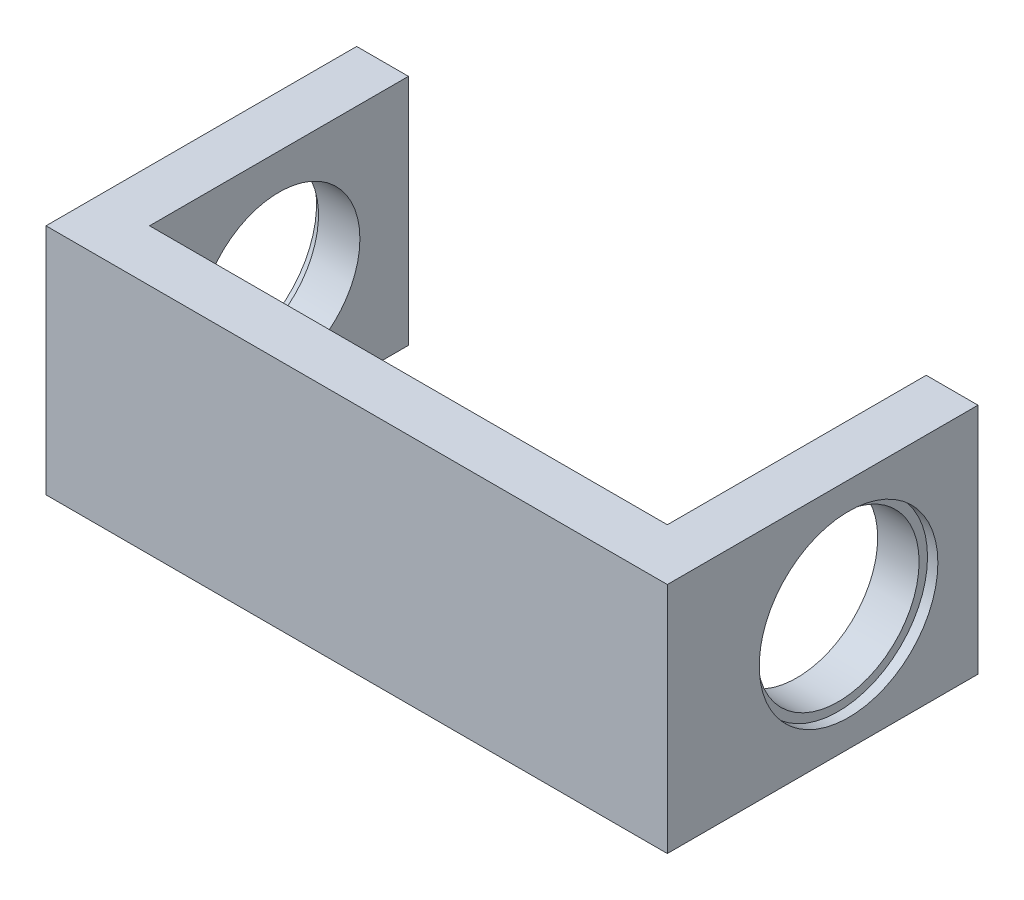
ISO-10303-21;
HEADER;
FILE_DESCRIPTION(('STEP AP214'),'2;1');
FILE_NAME('part.step','',(''),(''),'','','');
FILE_SCHEMA(('AUTOMOTIVE_DESIGN { 1 0 10303 214 1 1 1 1 }'));
ENDSEC;
DATA;
#1=APPLICATION_CONTEXT('core data for automotive mechanical design processes');
#2=APPLICATION_PROTOCOL_DEFINITION('international standard','automotive_design',2000,#1);
#3=PRODUCT_CONTEXT('',#1,'mechanical');
#4=PRODUCT('Part','Part','',(#3));
#5=PRODUCT_RELATED_PRODUCT_CATEGORY('part','',(#4));
#6=PRODUCT_DEFINITION_FORMATION('','',#4);
#7=PRODUCT_DEFINITION_CONTEXT('part definition',#1,'design');
#8=PRODUCT_DEFINITION('design','',#6,#7);
#9=PRODUCT_DEFINITION_SHAPE('','',#8);
#10=(LENGTH_UNIT() NAMED_UNIT(*) SI_UNIT(.MILLI.,.METRE.));
#11=(NAMED_UNIT(*) PLANE_ANGLE_UNIT() SI_UNIT($,.RADIAN.));
#12=(NAMED_UNIT(*) SI_UNIT($,.STERADIAN.) SOLID_ANGLE_UNIT());
#13=UNCERTAINTY_MEASURE_WITH_UNIT(LENGTH_MEASURE(1.E-05),#10,'distance_accuracy_value','');
#14=(GEOMETRIC_REPRESENTATION_CONTEXT(3) GLOBAL_UNCERTAINTY_ASSIGNED_CONTEXT((#13)) GLOBAL_UNIT_ASSIGNED_CONTEXT((#10,
#11,#12)) REPRESENTATION_CONTEXT('',''));
#15=CARTESIAN_POINT('',(0.,0.,0.));
#16=DIRECTION('',(0.,0.,1.));
#17=DIRECTION('',(1.,0.,0.));
#18=AXIS2_PLACEMENT_3D('',#15,#16,#17);
#19=CARTESIAN_POINT('',(55.88,22.86,0.));
#20=DIRECTION('',(-1.,0.,0.));
#21=DIRECTION('',(0.,0.,1.));
#22=AXIS2_PLACEMENT_3D('',#19,#20,#21);
#23=PLANE('',#22);
#24=CARTESIAN_POINT('',(55.88,11.43,-12.7));
#25=DIRECTION('',(1.,0.,0.));
#26=DIRECTION('',(0.,0.,-1.));
#27=AXIS2_PLACEMENT_3D('',#24,#25,#26);
#28=CIRCLE('',#27,8.763);
#29=CARTESIAN_POINT('',(55.88,11.43,-21.463));
#30=VERTEX_POINT('',#29);
#31=EDGE_CURVE('E190',#30,#30,#28,.T.);
#32=ORIENTED_EDGE('',*,*,#31,.F.);
#33=EDGE_LOOP('',(#32));
#34=FACE_BOUND('',#33,.T.);
#35=DIRECTION('',(0.,0.,-1.));
#36=VECTOR('',#35,1.);
#37=CARTESIAN_POINT('',(55.88,0.,0.));
#38=LINE('',#37,#36);
#39=CARTESIAN_POINT('',(55.88,0.,5.08));
#40=VERTEX_POINT('',#39);
#41=CARTESIAN_POINT('',(55.88,0.,-25.4));
#42=VERTEX_POINT('',#41);
#43=EDGE_CURVE('E134',#40,#42,#38,.T.);
#44=ORIENTED_EDGE('',*,*,#43,.T.);
#45=DIRECTION('',(0.,-1.,0.));
#46=VECTOR('',#45,1.);
#47=CARTESIAN_POINT('',(55.88,22.86,-25.4));
#48=LINE('',#47,#46);
#49=CARTESIAN_POINT('',(55.88,22.86,-25.4));
#50=VERTEX_POINT('',#49);
#51=EDGE_CURVE('E11',#50,#42,#48,.T.);
#52=ORIENTED_EDGE('',*,*,#51,.F.);
#53=DIRECTION('',(0.,0.,-1.));
#54=VECTOR('',#53,1.);
#55=CARTESIAN_POINT('',(55.88,22.86,0.));
#56=LINE('',#55,#54);
#57=CARTESIAN_POINT('',(55.88,22.86,5.08));
#58=VERTEX_POINT('',#57);
#59=EDGE_CURVE('E92',#58,#50,#56,.T.);
#60=ORIENTED_EDGE('',*,*,#59,.F.);
#61=DIRECTION('',(0.,-1.,0.));
#62=VECTOR('',#61,1.);
#63=CARTESIAN_POINT('',(55.88,22.86,5.08));
#64=LINE('',#63,#62);
#65=EDGE_CURVE('E133',#58,#40,#64,.T.);
#66=ORIENTED_EDGE('',*,*,#65,.T.);
#67=EDGE_LOOP('',(#44,#52,#60,#66));
#68=FACE_BOUND('',#67,.T.);
#69=ADVANCED_FACE('F37',(#34,#68),#23,.F.);
#70=CARTESIAN_POINT('',(50.8,22.86,-25.4));
#71=DIRECTION('',(0.,0.,-1.));
#72=DIRECTION('',(-1.,0.,0.));
#73=AXIS2_PLACEMENT_3D('',#70,#71,#72);
#74=PLANE('',#73);
#75=DIRECTION('',(1.,0.,0.));
#76=VECTOR('',#75,1.);
#77=CARTESIAN_POINT('',(50.8,0.,-25.4));
#78=LINE('',#77,#76);
#79=CARTESIAN_POINT('',(50.8,0.,-25.4));
#80=VERTEX_POINT('',#79);
#81=EDGE_CURVE('E137',#80,#42,#78,.T.);
#82=ORIENTED_EDGE('',*,*,#81,.F.);
#83=DIRECTION('',(0.,-1.,0.));
#84=VECTOR('',#83,1.);
#85=CARTESIAN_POINT('',(50.8,22.86,-25.4));
#86=LINE('',#85,#84);
#87=CARTESIAN_POINT('',(50.8,22.86,-25.4));
#88=VERTEX_POINT('',#87);
#89=EDGE_CURVE('E45',#88,#80,#86,.T.);
#90=ORIENTED_EDGE('',*,*,#89,.F.);
#91=DIRECTION('',(1.,0.,0.));
#92=VECTOR('',#91,1.);
#93=CARTESIAN_POINT('',(50.8,22.86,-25.4));
#94=LINE('',#93,#92);
#95=EDGE_CURVE('E177',#88,#50,#94,.T.);
#96=ORIENTED_EDGE('',*,*,#95,.T.);
#97=ORIENTED_EDGE('',*,*,#51,.T.);
#98=EDGE_LOOP('',(#82,#90,#96,#97));
#99=FACE_BOUND('',#98,.T.);
#100=ADVANCED_FACE('F168',(#99),#74,.T.);
#101=CARTESIAN_POINT('',(50.8,22.86,0.));
#102=DIRECTION('',(-1.,0.,0.));
#103=DIRECTION('',(0.,0.,1.));
#104=AXIS2_PLACEMENT_3D('',#101,#102,#103);
#105=PLANE('',#104);
#106=CARTESIAN_POINT('',(50.8,11.43,-12.7));
#107=DIRECTION('',(-1.,0.,0.));
#108=DIRECTION('',(0.,0.,1.));
#109=AXIS2_PLACEMENT_3D('',#106,#107,#108);
#110=CIRCLE('',#109,7.9375);
#111=CARTESIAN_POINT('',(50.8,11.43,-4.7625));
#112=VERTEX_POINT('',#111);
#113=EDGE_CURVE('E138',#112,#112,#110,.T.);
#114=ORIENTED_EDGE('',*,*,#113,.F.);
#115=EDGE_LOOP('',(#114));
#116=FACE_BOUND('',#115,.T.);
#117=DIRECTION('',(0.,0.,-1.));
#118=VECTOR('',#117,1.);
#119=CARTESIAN_POINT('',(50.8,0.,0.));
#120=LINE('',#119,#118);
#121=CARTESIAN_POINT('',(50.8,0.,0.));
#122=VERTEX_POINT('',#121);
#123=EDGE_CURVE('E141',#122,#80,#120,.T.);
#124=ORIENTED_EDGE('',*,*,#123,.F.);
#125=DIRECTION('',(0.,-1.,0.));
#126=VECTOR('',#125,1.);
#127=CARTESIAN_POINT('',(50.8,22.86,0.));
#128=LINE('',#127,#126);
#129=CARTESIAN_POINT('',(50.8,22.86,0.));
#130=VERTEX_POINT('',#129);
#131=EDGE_CURVE('E158',#130,#122,#128,.T.);
#132=ORIENTED_EDGE('',*,*,#131,.F.);
#133=DIRECTION('',(0.,0.,-1.));
#134=VECTOR('',#133,1.);
#135=CARTESIAN_POINT('',(50.8,22.86,0.));
#136=LINE('',#135,#134);
#137=EDGE_CURVE('E165',#130,#88,#136,.T.);
#138=ORIENTED_EDGE('',*,*,#137,.T.);
#139=ORIENTED_EDGE('',*,*,#89,.T.);
#140=EDGE_LOOP('',(#124,#132,#138,#139));
#141=FACE_BOUND('',#140,.T.);
#142=ADVANCED_FACE('F163',(#116,#141),#105,.T.);
#143=CARTESIAN_POINT('',(0.,22.86,0.));
#144=DIRECTION('',(0.,0.,-1.));
#145=DIRECTION('',(-1.,0.,0.));
#146=AXIS2_PLACEMENT_3D('',#143,#144,#145);
#147=PLANE('',#146);
#148=DIRECTION('',(1.,0.,0.));
#149=VECTOR('',#148,1.);
#150=CARTESIAN_POINT('',(0.,0.,0.));
#151=LINE('',#150,#149);
#152=CARTESIAN_POINT('',(0.,0.,0.));
#153=VERTEX_POINT('',#152);
#154=EDGE_CURVE('E144',#153,#122,#151,.T.);
#155=ORIENTED_EDGE('',*,*,#154,.F.);
#156=DIRECTION('',(0.,-1.,0.));
#157=VECTOR('',#156,1.);
#158=CARTESIAN_POINT('',(0.,22.86,0.));
#159=LINE('',#158,#157);
#160=CARTESIAN_POINT('',(0.,22.86,0.));
#161=VERTEX_POINT('',#160);
#162=EDGE_CURVE('E156',#161,#153,#159,.T.);
#163=ORIENTED_EDGE('',*,*,#162,.F.);
#164=DIRECTION('',(1.,0.,0.));
#165=VECTOR('',#164,1.);
#166=CARTESIAN_POINT('',(0.,22.86,0.));
#167=LINE('',#166,#165);
#168=EDGE_CURVE('E128',#161,#130,#167,.T.);
#169=ORIENTED_EDGE('',*,*,#168,.T.);
#170=ORIENTED_EDGE('',*,*,#131,.T.);
#171=EDGE_LOOP('',(#155,#163,#169,#170));
#172=FACE_BOUND('',#171,.T.);
#173=ADVANCED_FACE('F175',(#172),#147,.T.);
#174=CARTESIAN_POINT('',(0.,22.86,-25.4));
#175=DIRECTION('',(1.,0.,0.));
#176=DIRECTION('',(0.,0.,-1.));
#177=AXIS2_PLACEMENT_3D('',#174,#175,#176);
#178=PLANE('',#177);
#179=CARTESIAN_POINT('',(0.,11.43,-12.7));
#180=DIRECTION('',(1.,0.,0.));
#181=DIRECTION('',(0.,0.,-1.));
#182=AXIS2_PLACEMENT_3D('',#179,#180,#181);
#183=CIRCLE('',#182,7.9375);
#184=CARTESIAN_POINT('',(0.,11.43,-20.6375));
#185=VERTEX_POINT('',#184);
#186=EDGE_CURVE('E193',#185,#185,#183,.T.);
#187=ORIENTED_EDGE('',*,*,#186,.F.);
#188=EDGE_LOOP('',(#187));
#189=FACE_BOUND('',#188,.T.);
#190=DIRECTION('',(0.,0.,1.));
#191=VECTOR('',#190,1.);
#192=CARTESIAN_POINT('',(0.,0.,-25.4));
#193=LINE('',#192,#191);
#194=CARTESIAN_POINT('',(0.,0.,-25.4));
#195=VERTEX_POINT('',#194);
#196=EDGE_CURVE('E147',#195,#153,#193,.T.);
#197=ORIENTED_EDGE('',*,*,#196,.F.);
#198=DIRECTION('',(0.,-1.,0.));
#199=VECTOR('',#198,1.);
#200=CARTESIAN_POINT('',(0.,22.86,-25.4));
#201=LINE('',#200,#199);
#202=CARTESIAN_POINT('',(0.,22.86,-25.4));
#203=VERTEX_POINT('',#202);
#204=EDGE_CURVE('E116',#203,#195,#201,.T.);
#205=ORIENTED_EDGE('',*,*,#204,.F.);
#206=DIRECTION('',(0.,0.,1.));
#207=VECTOR('',#206,1.);
#208=CARTESIAN_POINT('',(0.,22.86,-25.4));
#209=LINE('',#208,#207);
#210=EDGE_CURVE('E126',#203,#161,#209,.T.);
#211=ORIENTED_EDGE('',*,*,#210,.T.);
#212=ORIENTED_EDGE('',*,*,#162,.T.);
#213=EDGE_LOOP('',(#197,#205,#211,#212));
#214=FACE_BOUND('',#213,.T.);
#215=ADVANCED_FACE('F218',(#189,#214),#178,.T.);
#216=CARTESIAN_POINT('',(-5.08,22.86,-25.4));
#217=DIRECTION('',(0.,0.,-1.));
#218=DIRECTION('',(-1.,0.,0.));
#219=AXIS2_PLACEMENT_3D('',#216,#217,#218);
#220=PLANE('',#219);
#221=DIRECTION('',(1.,0.,0.));
#222=VECTOR('',#221,1.);
#223=CARTESIAN_POINT('',(-5.08,0.,-25.4));
#224=LINE('',#223,#222);
#225=CARTESIAN_POINT('',(-5.08,0.,-25.4));
#226=VERTEX_POINT('',#225);
#227=EDGE_CURVE('E115',#226,#195,#224,.T.);
#228=ORIENTED_EDGE('',*,*,#227,.F.);
#229=DIRECTION('',(0.,-1.,0.));
#230=VECTOR('',#229,1.);
#231=CARTESIAN_POINT('',(-5.08,22.86,-25.4));
#232=LINE('',#231,#230);
#233=CARTESIAN_POINT('',(-5.08,22.86,-25.4));
#234=VERTEX_POINT('',#233);
#235=EDGE_CURVE('E109',#234,#226,#232,.T.);
#236=ORIENTED_EDGE('',*,*,#235,.F.);
#237=DIRECTION('',(1.,0.,0.));
#238=VECTOR('',#237,1.);
#239=CARTESIAN_POINT('',(-5.08,22.86,-25.4));
#240=LINE('',#239,#238);
#241=EDGE_CURVE('E113',#234,#203,#240,.T.);
#242=ORIENTED_EDGE('',*,*,#241,.T.);
#243=ORIENTED_EDGE('',*,*,#204,.T.);
#244=EDGE_LOOP('',(#228,#236,#242,#243));
#245=FACE_BOUND('',#244,.T.);
#246=ADVANCED_FACE('F111',(#245),#220,.T.);
#247=CARTESIAN_POINT('',(-5.08,22.86,-25.4));
#248=DIRECTION('',(1.,0.,0.));
#249=DIRECTION('',(0.,0.,-1.));
#250=AXIS2_PLACEMENT_3D('',#247,#248,#249);
#251=PLANE('',#250);
#252=CARTESIAN_POINT('',(-5.08,11.43,-12.7));
#253=DIRECTION('',(-1.,0.,0.));
#254=DIRECTION('',(0.,0.,1.));
#255=AXIS2_PLACEMENT_3D('',#252,#253,#254);
#256=CIRCLE('',#255,8.763);
#257=CARTESIAN_POINT('',(-5.08,11.43,-3.937));
#258=VERTEX_POINT('',#257);
#259=EDGE_CURVE('E202',#258,#258,#256,.T.);
#260=ORIENTED_EDGE('',*,*,#259,.F.);
#261=EDGE_LOOP('',(#260));
#262=FACE_BOUND('',#261,.T.);
#263=DIRECTION('',(0.,0.,-1.));
#264=VECTOR('',#263,1.);
#265=CARTESIAN_POINT('',(-5.08,0.,-25.4));
#266=LINE('',#265,#264);
#267=CARTESIAN_POINT('',(-5.08,0.,5.08));
#268=VERTEX_POINT('',#267);
#269=EDGE_CURVE('E80',#226,#268,#266,.F.);
#270=ORIENTED_EDGE('',*,*,#269,.T.);
#271=DIRECTION('',(0.,-1.,0.));
#272=VECTOR('',#271,1.);
#273=CARTESIAN_POINT('',(-5.08,22.86,5.08));
#274=LINE('',#273,#272);
#275=CARTESIAN_POINT('',(-5.08,22.86,5.08));
#276=VERTEX_POINT('',#275);
#277=EDGE_CURVE('E117',#276,#268,#274,.T.);
#278=ORIENTED_EDGE('',*,*,#277,.F.);
#279=DIRECTION('',(0.,0.,-1.));
#280=VECTOR('',#279,1.);
#281=CARTESIAN_POINT('',(-5.08,22.86,-25.4));
#282=LINE('',#281,#280);
#283=EDGE_CURVE('E119',#234,#276,#282,.F.);
#284=ORIENTED_EDGE('',*,*,#283,.F.);
#285=ORIENTED_EDGE('',*,*,#235,.T.);
#286=EDGE_LOOP('',(#270,#278,#284,#285));
#287=FACE_BOUND('',#286,.T.);
#288=ADVANCED_FACE('F120',(#262,#287),#251,.F.);
#289=CARTESIAN_POINT('',(0.,22.86,5.08));
#290=DIRECTION('',(0.,0.,-1.));
#291=DIRECTION('',(-1.,0.,0.));
#292=AXIS2_PLACEMENT_3D('',#289,#290,#291);
#293=PLANE('',#292);
#294=DIRECTION('',(1.,0.,0.));
#295=VECTOR('',#294,1.);
#296=CARTESIAN_POINT('',(0.,0.,5.08));
#297=LINE('',#296,#295);
#298=EDGE_CURVE('E86',#268,#40,#297,.T.);
#299=ORIENTED_EDGE('',*,*,#298,.T.);
#300=ORIENTED_EDGE('',*,*,#65,.F.);
#301=DIRECTION('',(1.,0.,0.));
#302=VECTOR('',#301,1.);
#303=CARTESIAN_POINT('',(0.,22.86,5.08));
#304=LINE('',#303,#302);
#305=EDGE_CURVE('E53',#276,#58,#304,.T.);
#306=ORIENTED_EDGE('',*,*,#305,.F.);
#307=ORIENTED_EDGE('',*,*,#277,.T.);
#308=EDGE_LOOP('',(#299,#300,#306,#307));
#309=FACE_BOUND('',#308,.T.);
#310=ADVANCED_FACE('F209',(#309),#293,.F.);
#311=CARTESIAN_POINT('',(0.,22.86,0.));
#312=DIRECTION('',(0.,-1.,0.));
#313=DIRECTION('',(-1.,0.,0.));
#314=AXIS2_PLACEMENT_3D('',#311,#312,#313);
#315=PLANE('',#314);
#316=ORIENTED_EDGE('',*,*,#59,.T.);
#317=ORIENTED_EDGE('',*,*,#95,.F.);
#318=ORIENTED_EDGE('',*,*,#137,.F.);
#319=ORIENTED_EDGE('',*,*,#168,.F.);
#320=ORIENTED_EDGE('',*,*,#210,.F.);
#321=ORIENTED_EDGE('',*,*,#241,.F.);
#322=ORIENTED_EDGE('',*,*,#283,.T.);
#323=ORIENTED_EDGE('',*,*,#305,.T.);
#324=EDGE_LOOP('',(#316,#317,#318,#319,#320,#321,#322,#323));
#325=FACE_BOUND('',#324,.T.);
#326=ADVANCED_FACE('F123',(#325),#315,.F.);
#327=CARTESIAN_POINT('',(0.,0.,0.));
#328=DIRECTION('',(0.,-1.,0.));
#329=DIRECTION('',(-1.,0.,0.));
#330=AXIS2_PLACEMENT_3D('',#327,#328,#329);
#331=PLANE('',#330);
#332=ORIENTED_EDGE('',*,*,#43,.F.);
#333=ORIENTED_EDGE('',*,*,#298,.F.);
#334=ORIENTED_EDGE('',*,*,#269,.F.);
#335=ORIENTED_EDGE('',*,*,#227,.T.);
#336=ORIENTED_EDGE('',*,*,#196,.T.);
#337=ORIENTED_EDGE('',*,*,#154,.T.);
#338=ORIENTED_EDGE('',*,*,#123,.T.);
#339=ORIENTED_EDGE('',*,*,#81,.T.);
#340=EDGE_LOOP('',(#332,#333,#334,#335,#336,#337,#338,#339));
#341=FACE_BOUND('',#340,.T.);
#342=ADVANCED_FACE('F171',(#341),#331,.T.);
#343=CARTESIAN_POINT('',(55.88,11.43,-12.7));
#344=DIRECTION('',(1.,0.,0.));
#345=DIRECTION('',(0.,0.,-1.));
#346=AXIS2_PLACEMENT_3D('',#343,#344,#345);
#347=CYLINDRICAL_SURFACE('',#346,7.9375);
#348=CARTESIAN_POINT('',(54.864,11.43,-12.7));
#349=DIRECTION('',(1.,0.,0.));
#350=DIRECTION('',(0.,0.,-1.));
#351=AXIS2_PLACEMENT_3D('',#348,#349,#350);
#352=CIRCLE('',#351,7.9375);
#353=CARTESIAN_POINT('',(54.864,11.43,-20.6375));
#354=VERTEX_POINT('',#353);
#355=EDGE_CURVE('E184',#354,#354,#352,.T.);
#356=ORIENTED_EDGE('',*,*,#355,.T.);
#357=EDGE_LOOP('',(#356));
#358=FACE_BOUND('',#357,.T.);
#359=ORIENTED_EDGE('',*,*,#113,.T.);
#360=EDGE_LOOP('',(#359));
#361=FACE_BOUND('',#360,.T.);
#362=ADVANCED_FACE('F243',(#358,#361),#347,.F.);
#363=CARTESIAN_POINT('',(54.864,19.3675,-12.7));
#364=DIRECTION('',(-1.,0.,0.));
#365=DIRECTION('',(0.,0.,1.));
#366=AXIS2_PLACEMENT_3D('',#363,#364,#365);
#367=PLANE('',#366);
#368=ORIENTED_EDGE('',*,*,#355,.F.);
#369=EDGE_LOOP('',(#368));
#370=FACE_BOUND('',#369,.T.);
#371=CARTESIAN_POINT('',(54.864,11.43,-12.7));
#372=DIRECTION('',(1.,0.,0.));
#373=DIRECTION('',(0.,0.,-1.));
#374=AXIS2_PLACEMENT_3D('',#371,#372,#373);
#375=CIRCLE('',#374,8.763);
#376=CARTESIAN_POINT('',(54.864,11.43,-21.463));
#377=VERTEX_POINT('',#376);
#378=EDGE_CURVE('E187',#377,#377,#375,.T.);
#379=ORIENTED_EDGE('',*,*,#378,.T.);
#380=EDGE_LOOP('',(#379));
#381=FACE_BOUND('',#380,.T.);
#382=ADVANCED_FACE('F233',(#370,#381),#367,.F.);
#383=CARTESIAN_POINT('',(55.88,11.43,-12.7));
#384=DIRECTION('',(1.,0.,0.));
#385=DIRECTION('',(0.,0.,-1.));
#386=AXIS2_PLACEMENT_3D('',#383,#384,#385);
#387=CYLINDRICAL_SURFACE('',#386,8.763);
#388=ORIENTED_EDGE('',*,*,#378,.F.);
#389=EDGE_LOOP('',(#388));
#390=FACE_BOUND('',#389,.T.);
#391=ORIENTED_EDGE('',*,*,#31,.T.);
#392=EDGE_LOOP('',(#391));
#393=FACE_BOUND('',#392,.T.);
#394=ADVANCED_FACE('F230',(#390,#393),#387,.F.);
#395=CARTESIAN_POINT('',(-5.08,11.43,-12.7));
#396=DIRECTION('',(-1.,0.,0.));
#397=DIRECTION('',(0.,0.,1.));
#398=AXIS2_PLACEMENT_3D('',#395,#396,#397);
#399=CYLINDRICAL_SURFACE('',#398,7.9375);
#400=CARTESIAN_POINT('',(-4.064,11.43,-12.7));
#401=DIRECTION('',(-1.,0.,0.));
#402=DIRECTION('',(0.,0.,1.));
#403=AXIS2_PLACEMENT_3D('',#400,#401,#402);
#404=CIRCLE('',#403,7.9375);
#405=CARTESIAN_POINT('',(-4.064,11.43,-4.7625));
#406=VERTEX_POINT('',#405);
#407=EDGE_CURVE('E196',#406,#406,#404,.T.);
#408=ORIENTED_EDGE('',*,*,#407,.T.);
#409=EDGE_LOOP('',(#408));
#410=FACE_BOUND('',#409,.T.);
#411=ORIENTED_EDGE('',*,*,#186,.T.);
#412=EDGE_LOOP('',(#411));
#413=FACE_BOUND('',#412,.T.);
#414=ADVANCED_FACE('F232',(#410,#413),#399,.F.);
#415=CARTESIAN_POINT('',(-4.064,19.3675,-12.7));
#416=DIRECTION('',(1.,0.,0.));
#417=DIRECTION('',(0.,0.,-1.));
#418=AXIS2_PLACEMENT_3D('',#415,#416,#417);
#419=PLANE('',#418);
#420=ORIENTED_EDGE('',*,*,#407,.F.);
#421=EDGE_LOOP('',(#420));
#422=FACE_BOUND('',#421,.T.);
#423=CARTESIAN_POINT('',(-4.064,11.43,-12.7));
#424=DIRECTION('',(-1.,0.,0.));
#425=DIRECTION('',(0.,0.,1.));
#426=AXIS2_PLACEMENT_3D('',#423,#424,#425);
#427=CIRCLE('',#426,8.763);
#428=CARTESIAN_POINT('',(-4.064,11.43,-3.937));
#429=VERTEX_POINT('',#428);
#430=EDGE_CURVE('E199',#429,#429,#427,.T.);
#431=ORIENTED_EDGE('',*,*,#430,.T.);
#432=EDGE_LOOP('',(#431));
#433=FACE_BOUND('',#432,.T.);
#434=ADVANCED_FACE('F240',(#422,#433),#419,.F.);
#435=CARTESIAN_POINT('',(-5.08,11.43,-12.7));
#436=DIRECTION('',(-1.,0.,0.));
#437=DIRECTION('',(0.,0.,1.));
#438=AXIS2_PLACEMENT_3D('',#435,#436,#437);
#439=CYLINDRICAL_SURFACE('',#438,8.763);
#440=ORIENTED_EDGE('',*,*,#430,.F.);
#441=EDGE_LOOP('',(#440));
#442=FACE_BOUND('',#441,.T.);
#443=ORIENTED_EDGE('',*,*,#259,.T.);
#444=EDGE_LOOP('',(#443));
#445=FACE_BOUND('',#444,.T.);
#446=ADVANCED_FACE('F206',(#442,#445),#439,.F.);
#447=CLOSED_SHELL('',(#69,#100,#142,#173,#215,#246,#288,#310,#326,#342,#362,#382,#394,#414,#434,#446));
#448=MANIFOLD_SOLID_BREP('B2',#447);
#449=ADVANCED_BREP_SHAPE_REPRESENTATION('',(#18,#448),#14);
#450=SHAPE_DEFINITION_REPRESENTATION(#9,#449);
ENDSEC;
END-ISO-10303-21;
